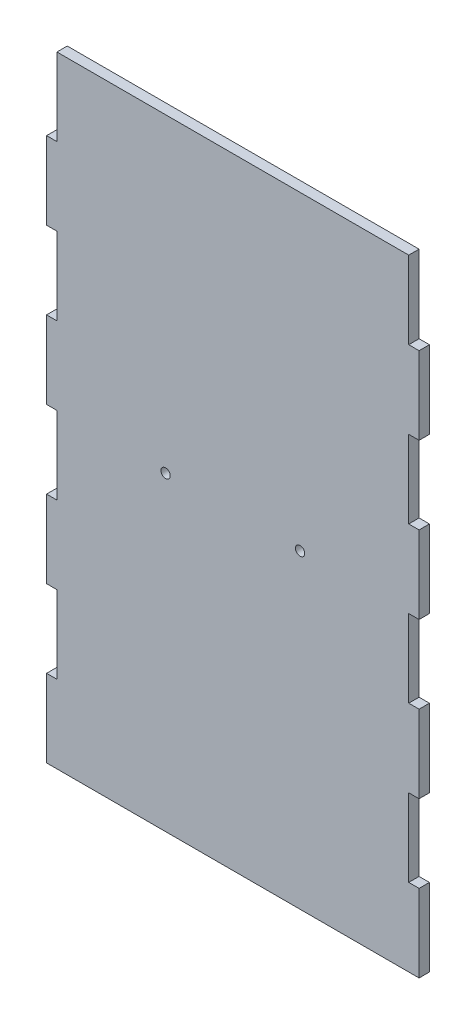
ISO-10303-21;
HEADER;
FILE_DESCRIPTION(('STEP AP214'),'2;1');
FILE_NAME('part.step','',(''),(''),'','','');
FILE_SCHEMA(('AUTOMOTIVE_DESIGN { 1 0 10303 214 1 1 1 1 }'));
ENDSEC;
DATA;
#1=APPLICATION_CONTEXT('core data for automotive mechanical design processes');
#2=APPLICATION_PROTOCOL_DEFINITION('international standard','automotive_design',2000,#1);
#3=PRODUCT_CONTEXT('',#1,'mechanical');
#4=PRODUCT('Part','Part','',(#3));
#5=PRODUCT_RELATED_PRODUCT_CATEGORY('part','',(#4));
#6=PRODUCT_DEFINITION_FORMATION('','',#4);
#7=PRODUCT_DEFINITION_CONTEXT('part definition',#1,'design');
#8=PRODUCT_DEFINITION('design','',#6,#7);
#9=PRODUCT_DEFINITION_SHAPE('','',#8);
#10=(LENGTH_UNIT() NAMED_UNIT(*) SI_UNIT(.MILLI.,.METRE.));
#11=(NAMED_UNIT(*) PLANE_ANGLE_UNIT() SI_UNIT($,.RADIAN.));
#12=(NAMED_UNIT(*) SI_UNIT($,.STERADIAN.) SOLID_ANGLE_UNIT());
#13=UNCERTAINTY_MEASURE_WITH_UNIT(LENGTH_MEASURE(1.E-05),#10,'distance_accuracy_value','');
#14=(GEOMETRIC_REPRESENTATION_CONTEXT(3) GLOBAL_UNCERTAINTY_ASSIGNED_CONTEXT((#13)) GLOBAL_UNIT_ASSIGNED_CONTEXT((#10,
#11,#12)) REPRESENTATION_CONTEXT('',''));
#15=CARTESIAN_POINT('',(0.,0.,0.));
#16=DIRECTION('',(0.,0.,1.));
#17=DIRECTION('',(1.,0.,0.));
#18=AXIS2_PLACEMENT_3D('',#15,#16,#17);
#19=CARTESIAN_POINT('',(90.,0.,5.));
#20=DIRECTION('',(-1.,0.,0.));
#21=DIRECTION('',(0.,0.,1.));
#22=AXIS2_PLACEMENT_3D('',#19,#20,#21);
#23=PLANE('',#22);
#24=DIRECTION('',(0.,1.,0.));
#25=VECTOR('',#24,1.);
#26=CARTESIAN_POINT('',(90.,0.,0.));
#27=LINE('',#26,#25);
#28=CARTESIAN_POINT('',(90.,0.,0.));
#29=VERTEX_POINT('',#28);
#30=CARTESIAN_POINT('',(90.,37.4999999999999,0.));
#31=VERTEX_POINT('',#30);
#32=EDGE_CURVE('E261',#29,#31,#27,.T.);
#33=ORIENTED_EDGE('',*,*,#32,.T.);
#34=DIRECTION('',(0.,0.,1.));
#35=VECTOR('',#34,1.);
#36=CARTESIAN_POINT('',(90.,37.4999999999999,-0.00100000000000013));
#37=LINE('',#36,#35);
#38=CARTESIAN_POINT('',(90.,37.4999999999999,5.));
#39=VERTEX_POINT('',#38);
#40=EDGE_CURVE('E241',#31,#39,#37,.T.);
#41=ORIENTED_EDGE('',*,*,#40,.T.);
#42=DIRECTION('',(0.,1.,0.));
#43=VECTOR('',#42,1.);
#44=CARTESIAN_POINT('',(90.,0.,5.));
#45=LINE('',#44,#43);
#46=CARTESIAN_POINT('',(90.,0.,5.));
#47=VERTEX_POINT('',#46);
#48=EDGE_CURVE('E294',#47,#39,#45,.T.);
#49=ORIENTED_EDGE('',*,*,#48,.F.);
#50=DIRECTION('',(0.,0.,-1.));
#51=VECTOR('',#50,1.);
#52=CARTESIAN_POINT('',(90.,0.,5.));
#53=LINE('',#52,#51);
#54=EDGE_CURVE('E41',#47,#29,#53,.T.);
#55=ORIENTED_EDGE('',*,*,#54,.T.);
#56=EDGE_LOOP('',(#33,#41,#49,#55));
#57=FACE_BOUND('',#56,.T.);
#58=ADVANCED_FACE('F33',(#57),#23,.F.);
#59=CARTESIAN_POINT('',(90.,74.9999999999999,5.));
#60=VERTEX_POINT('',#59);
#61=CARTESIAN_POINT('',(90.,112.5,5.));
#62=VERTEX_POINT('',#61);
#63=EDGE_CURVE('E297',#60,#62,#45,.T.);
#64=ORIENTED_EDGE('',*,*,#63,.F.);
#65=DIRECTION('',(0.,0.,1.));
#66=VECTOR('',#65,1.);
#67=CARTESIAN_POINT('',(90.,74.9999999999999,-0.00100000000000013));
#68=LINE('',#67,#66);
#69=CARTESIAN_POINT('',(90.,74.9999999999999,0.));
#70=VERTEX_POINT('',#69);
#71=EDGE_CURVE('E552',#70,#60,#68,.T.);
#72=ORIENTED_EDGE('',*,*,#71,.F.);
#73=CARTESIAN_POINT('',(90.,112.5,0.));
#74=VERTEX_POINT('',#73);
#75=EDGE_CURVE('E269',#70,#74,#27,.T.);
#76=ORIENTED_EDGE('',*,*,#75,.T.);
#77=DIRECTION('',(0.,0.,1.));
#78=VECTOR('',#77,1.);
#79=CARTESIAN_POINT('',(90.,112.5,-0.00100000000000013));
#80=LINE('',#79,#78);
#81=EDGE_CURVE('E575',#74,#62,#80,.T.);
#82=ORIENTED_EDGE('',*,*,#81,.T.);
#83=EDGE_LOOP('',(#64,#72,#76,#82));
#84=FACE_BOUND('',#83,.T.);
#85=ADVANCED_FACE('F453',(#84),#23,.F.);
#86=CARTESIAN_POINT('',(90.,150.,5.));
#87=VERTEX_POINT('',#86);
#88=CARTESIAN_POINT('',(90.,187.5,5.));
#89=VERTEX_POINT('',#88);
#90=EDGE_CURVE('E480',#87,#89,#45,.T.);
#91=ORIENTED_EDGE('',*,*,#90,.F.);
#92=DIRECTION('',(0.,0.,1.));
#93=VECTOR('',#92,1.);
#94=CARTESIAN_POINT('',(90.,150.,-0.00100000000000013));
#95=LINE('',#94,#93);
#96=CARTESIAN_POINT('',(90.,150.,0.));
#97=VERTEX_POINT('',#96);
#98=EDGE_CURVE('E481',#97,#87,#95,.T.);
#99=ORIENTED_EDGE('',*,*,#98,.F.);
#100=CARTESIAN_POINT('',(90.,187.5,0.));
#101=VERTEX_POINT('',#100);
#102=EDGE_CURVE('E274',#97,#101,#27,.T.);
#103=ORIENTED_EDGE('',*,*,#102,.T.);
#104=DIRECTION('',(0.,0.,1.));
#105=VECTOR('',#104,1.);
#106=CARTESIAN_POINT('',(90.,187.5,-0.00100000000000013));
#107=LINE('',#106,#105);
#108=EDGE_CURVE('E484',#101,#89,#107,.T.);
#109=ORIENTED_EDGE('',*,*,#108,.T.);
#110=EDGE_LOOP('',(#91,#99,#103,#109));
#111=FACE_BOUND('',#110,.T.);
#112=ADVANCED_FACE('F457',(#111),#23,.F.);
#113=CARTESIAN_POINT('',(-90.,0.,5.));
#114=DIRECTION('',(1.,0.,0.));
#115=DIRECTION('',(0.,0.,-1.));
#116=AXIS2_PLACEMENT_3D('',#113,#114,#115);
#117=PLANE('',#116);
#118=DIRECTION('',(0.,-1.,0.));
#119=VECTOR('',#118,1.);
#120=CARTESIAN_POINT('',(-90.,0.,0.));
#121=LINE('',#120,#119);
#122=CARTESIAN_POINT('',(-90.,112.5,0.));
#123=VERTEX_POINT('',#122);
#124=CARTESIAN_POINT('',(-90.,75.,0.));
#125=VERTEX_POINT('',#124);
#126=EDGE_CURVE('E318',#123,#125,#121,.T.);
#127=ORIENTED_EDGE('',*,*,#126,.T.);
#128=DIRECTION('',(0.,0.,1.));
#129=VECTOR('',#128,1.);
#130=CARTESIAN_POINT('',(-90.,75.,-0.00100000000000013));
#131=LINE('',#130,#129);
#132=CARTESIAN_POINT('',(-90.,75.,5.));
#133=VERTEX_POINT('',#132);
#134=EDGE_CURVE('E330',#125,#133,#131,.T.);
#135=ORIENTED_EDGE('',*,*,#134,.T.);
#136=DIRECTION('',(0.,-1.,0.));
#137=VECTOR('',#136,1.);
#138=CARTESIAN_POINT('',(-90.,0.,5.));
#139=LINE('',#138,#137);
#140=CARTESIAN_POINT('',(-90.,112.5,5.));
#141=VERTEX_POINT('',#140);
#142=EDGE_CURVE('E541',#141,#133,#139,.T.);
#143=ORIENTED_EDGE('',*,*,#142,.F.);
#144=DIRECTION('',(0.,0.,1.));
#145=VECTOR('',#144,1.);
#146=CARTESIAN_POINT('',(-90.,112.5,-0.00100000000000013));
#147=LINE('',#146,#145);
#148=EDGE_CURVE('E332',#123,#141,#147,.T.);
#149=ORIENTED_EDGE('',*,*,#148,.F.);
#150=EDGE_LOOP('',(#127,#135,#143,#149));
#151=FACE_BOUND('',#150,.T.);
#152=ADVANCED_FACE('F328',(#151),#117,.F.);
#153=CARTESIAN_POINT('',(-90.,187.5,0.));
#154=VERTEX_POINT('',#153);
#155=CARTESIAN_POINT('',(-90.,150.,0.));
#156=VERTEX_POINT('',#155);
#157=EDGE_CURVE('E312',#154,#156,#121,.T.);
#158=ORIENTED_EDGE('',*,*,#157,.T.);
#159=DIRECTION('',(0.,0.,1.));
#160=VECTOR('',#159,1.);
#161=CARTESIAN_POINT('',(-90.,150.,-0.00100000000000013));
#162=LINE('',#161,#160);
#163=CARTESIAN_POINT('',(-90.,150.,5.));
#164=VERTEX_POINT('',#163);
#165=EDGE_CURVE('E378',#156,#164,#162,.T.);
#166=ORIENTED_EDGE('',*,*,#165,.T.);
#167=CARTESIAN_POINT('',(-90.,187.5,5.));
#168=VERTEX_POINT('',#167);
#169=EDGE_CURVE('E304',#168,#164,#139,.T.);
#170=ORIENTED_EDGE('',*,*,#169,.F.);
#171=DIRECTION('',(0.,0.,1.));
#172=VECTOR('',#171,1.);
#173=CARTESIAN_POINT('',(-90.,187.5,-0.00100000000000013));
#174=LINE('',#173,#172);
#175=EDGE_CURVE('E401',#154,#168,#174,.T.);
#176=ORIENTED_EDGE('',*,*,#175,.F.);
#177=EDGE_LOOP('',(#158,#166,#170,#176));
#178=FACE_BOUND('',#177,.T.);
#179=ADVANCED_FACE('F475',(#178),#117,.F.);
#180=CARTESIAN_POINT('',(-90.,262.5,0.));
#181=VERTEX_POINT('',#180);
#182=CARTESIAN_POINT('',(-90.,225.,0.));
#183=VERTEX_POINT('',#182);
#184=EDGE_CURVE('E310',#181,#183,#121,.T.);
#185=ORIENTED_EDGE('',*,*,#184,.T.);
#186=DIRECTION('',(0.,0.,1.));
#187=VECTOR('',#186,1.);
#188=CARTESIAN_POINT('',(-90.,225.,-0.00100000000000013));
#189=LINE('',#188,#187);
#190=CARTESIAN_POINT('',(-90.,225.,5.));
#191=VERTEX_POINT('',#190);
#192=EDGE_CURVE('E402',#183,#191,#189,.T.);
#193=ORIENTED_EDGE('',*,*,#192,.T.);
#194=CARTESIAN_POINT('',(-90.,262.5,5.));
#195=VERTEX_POINT('',#194);
#196=EDGE_CURVE('E301',#195,#191,#139,.T.);
#197=ORIENTED_EDGE('',*,*,#196,.F.);
#198=DIRECTION('',(0.,0.,1.));
#199=VECTOR('',#198,1.);
#200=CARTESIAN_POINT('',(-90.,262.5,-0.00100000000000013));
#201=LINE('',#200,#199);
#202=EDGE_CURVE('E421',#181,#195,#201,.T.);
#203=ORIENTED_EDGE('',*,*,#202,.F.);
#204=EDGE_LOOP('',(#185,#193,#197,#203));
#205=FACE_BOUND('',#204,.T.);
#206=ADVANCED_FACE('F523',(#205),#117,.F.);
#207=CARTESIAN_POINT('',(0.,0.,5.));
#208=DIRECTION('',(0.,0.,-1.));
#209=DIRECTION('',(-1.,0.,0.));
#210=AXIS2_PLACEMENT_3D('',#207,#208,#209);
#211=PLANE('',#210);
#212=CARTESIAN_POINT('',(-32.5,150.,5.));
#213=DIRECTION('',(0.,0.,1.));
#214=DIRECTION('',(1.,0.,0.));
#215=AXIS2_PLACEMENT_3D('',#212,#213,#214);
#216=CIRCLE('',#215,2.25);
#217=CARTESIAN_POINT('',(-30.25,150.,5.));
#218=VERTEX_POINT('',#217);
#219=EDGE_CURVE('E276',#218,#218,#216,.T.);
#220=ORIENTED_EDGE('',*,*,#219,.F.);
#221=EDGE_LOOP('',(#220));
#222=FACE_BOUND('',#221,.T.);
#223=ORIENTED_EDGE('',*,*,#48,.T.);
#224=DIRECTION('',(1.,0.,0.));
#225=VECTOR('',#224,1.);
#226=CARTESIAN_POINT('',(90.,37.4999999999999,5.));
#227=LINE('',#226,#225);
#228=CARTESIAN_POINT('',(85.,37.4999999999999,5.));
#229=VERTEX_POINT('',#228);
#230=EDGE_CURVE('E247',#229,#39,#227,.T.);
#231=ORIENTED_EDGE('',*,*,#230,.F.);
#232=DIRECTION('',(0.,-1.,0.));
#233=VECTOR('',#232,1.);
#234=CARTESIAN_POINT('',(84.9999999999999,74.9999999999999,5.));
#235=LINE('',#234,#233);
#236=CARTESIAN_POINT('',(84.9999999999999,74.9999999999999,5.));
#237=VERTEX_POINT('',#236);
#238=EDGE_CURVE('E551',#237,#229,#235,.T.);
#239=ORIENTED_EDGE('',*,*,#238,.F.);
#240=DIRECTION('',(-1.,0.,0.));
#241=VECTOR('',#240,1.);
#242=CARTESIAN_POINT('',(90.,74.9999999999999,5.));
#243=LINE('',#242,#241);
#244=EDGE_CURVE('E264',#60,#237,#243,.T.);
#245=ORIENTED_EDGE('',*,*,#244,.F.);
#246=ORIENTED_EDGE('',*,*,#63,.T.);
#247=DIRECTION('',(1.,0.,0.));
#248=VECTOR('',#247,1.);
#249=CARTESIAN_POINT('',(90.,112.5,5.));
#250=LINE('',#249,#248);
#251=CARTESIAN_POINT('',(84.9999999999999,112.5,5.));
#252=VERTEX_POINT('',#251);
#253=EDGE_CURVE('E572',#252,#62,#250,.T.);
#254=ORIENTED_EDGE('',*,*,#253,.F.);
#255=DIRECTION('',(0.,-1.,0.));
#256=VECTOR('',#255,1.);
#257=CARTESIAN_POINT('',(85.,150.,5.));
#258=LINE('',#257,#256);
#259=CARTESIAN_POINT('',(85.,150.,5.));
#260=VERTEX_POINT('',#259);
#261=EDGE_CURVE('E569',#260,#252,#258,.T.);
#262=ORIENTED_EDGE('',*,*,#261,.F.);
#263=DIRECTION('',(-1.,0.,0.));
#264=VECTOR('',#263,1.);
#265=CARTESIAN_POINT('',(90.,150.,5.));
#266=LINE('',#265,#264);
#267=EDGE_CURVE('E567',#87,#260,#266,.T.);
#268=ORIENTED_EDGE('',*,*,#267,.F.);
#269=ORIENTED_EDGE('',*,*,#90,.T.);
#270=DIRECTION('',(1.,0.,0.));
#271=VECTOR('',#270,1.);
#272=CARTESIAN_POINT('',(90.,187.5,5.));
#273=LINE('',#272,#271);
#274=CARTESIAN_POINT('',(84.9999999999999,187.5,5.));
#275=VERTEX_POINT('',#274);
#276=EDGE_CURVE('E595',#275,#89,#273,.T.);
#277=ORIENTED_EDGE('',*,*,#276,.F.);
#278=DIRECTION('',(0.,-1.,0.));
#279=VECTOR('',#278,1.);
#280=CARTESIAN_POINT('',(84.9999999999999,225.,5.));
#281=LINE('',#280,#279);
#282=CARTESIAN_POINT('',(84.9999999999999,225.,5.));
#283=VERTEX_POINT('',#282);
#284=EDGE_CURVE('E592',#283,#275,#281,.T.);
#285=ORIENTED_EDGE('',*,*,#284,.F.);
#286=DIRECTION('',(-1.,0.,0.));
#287=VECTOR('',#286,1.);
#288=CARTESIAN_POINT('',(90.,225.,5.));
#289=LINE('',#288,#287);
#290=CARTESIAN_POINT('',(90.,225.,5.));
#291=VERTEX_POINT('',#290);
#292=EDGE_CURVE('E496',#291,#283,#289,.T.);
#293=ORIENTED_EDGE('',*,*,#292,.F.);
#294=CARTESIAN_POINT('',(90.,262.5,5.));
#295=VERTEX_POINT('',#294);
#296=EDGE_CURVE('E298',#291,#295,#45,.T.);
#297=ORIENTED_EDGE('',*,*,#296,.T.);
#298=DIRECTION('',(1.,0.,0.));
#299=VECTOR('',#298,1.);
#300=CARTESIAN_POINT('',(90.,262.5,5.));
#301=LINE('',#300,#299);
#302=CARTESIAN_POINT('',(84.9999999999999,262.5,5.));
#303=VERTEX_POINT('',#302);
#304=EDGE_CURVE('E493',#303,#295,#301,.T.);
#305=ORIENTED_EDGE('',*,*,#304,.F.);
#306=DIRECTION('',(0.,-1.,0.));
#307=VECTOR('',#306,1.);
#308=CARTESIAN_POINT('',(85.,300.,5.));
#309=LINE('',#308,#307);
#310=CARTESIAN_POINT('',(85.,300.,5.));
#311=VERTEX_POINT('',#310);
#312=EDGE_CURVE('E504',#311,#303,#309,.T.);
#313=ORIENTED_EDGE('',*,*,#312,.F.);
#314=DIRECTION('',(-1.,0.,0.));
#315=VECTOR('',#314,1.);
#316=CARTESIAN_POINT('',(-90.,300.,5.));
#317=LINE('',#316,#315);
#318=CARTESIAN_POINT('',(-85.,300.,5.));
#319=VERTEX_POINT('',#318);
#320=EDGE_CURVE('E296',#311,#319,#317,.T.);
#321=ORIENTED_EDGE('',*,*,#320,.T.);
#322=DIRECTION('',(0.,1.,0.));
#323=VECTOR('',#322,1.);
#324=CARTESIAN_POINT('',(-85.,300.,5.));
#325=LINE('',#324,#323);
#326=CARTESIAN_POINT('',(-85.,262.5,5.));
#327=VERTEX_POINT('',#326);
#328=EDGE_CURVE('E418',#327,#319,#325,.T.);
#329=ORIENTED_EDGE('',*,*,#328,.F.);
#330=DIRECTION('',(1.,0.,0.));
#331=VECTOR('',#330,1.);
#332=CARTESIAN_POINT('',(-90.,262.5,5.));
#333=LINE('',#332,#331);
#334=EDGE_CURVE('E415',#195,#327,#333,.T.);
#335=ORIENTED_EDGE('',*,*,#334,.F.);
#336=ORIENTED_EDGE('',*,*,#196,.T.);
#337=DIRECTION('',(-1.,0.,0.));
#338=VECTOR('',#337,1.);
#339=CARTESIAN_POINT('',(-90.,225.,5.));
#340=LINE('',#339,#338);
#341=CARTESIAN_POINT('',(-85.,225.,5.));
#342=VERTEX_POINT('',#341);
#343=EDGE_CURVE('E399',#342,#191,#340,.T.);
#344=ORIENTED_EDGE('',*,*,#343,.F.);
#345=DIRECTION('',(0.,1.,0.));
#346=VECTOR('',#345,1.);
#347=CARTESIAN_POINT('',(-85.,225.,5.));
#348=LINE('',#347,#346);
#349=CARTESIAN_POINT('',(-85.,187.5,5.));
#350=VERTEX_POINT('',#349);
#351=EDGE_CURVE('E396',#350,#342,#348,.T.);
#352=ORIENTED_EDGE('',*,*,#351,.F.);
#353=DIRECTION('',(1.,0.,0.));
#354=VECTOR('',#353,1.);
#355=CARTESIAN_POINT('',(-90.,187.5,5.));
#356=LINE('',#355,#354);
#357=EDGE_CURVE('E393',#168,#350,#356,.T.);
#358=ORIENTED_EDGE('',*,*,#357,.F.);
#359=ORIENTED_EDGE('',*,*,#169,.T.);
#360=DIRECTION('',(-1.,0.,0.));
#361=VECTOR('',#360,1.);
#362=CARTESIAN_POINT('',(-90.,150.,5.));
#363=LINE('',#362,#361);
#364=CARTESIAN_POINT('',(-85.,150.,5.));
#365=VERTEX_POINT('',#364);
#366=EDGE_CURVE('E376',#365,#164,#363,.T.);
#367=ORIENTED_EDGE('',*,*,#366,.F.);
#368=DIRECTION('',(0.,1.,0.));
#369=VECTOR('',#368,1.);
#370=CARTESIAN_POINT('',(-85.,150.,5.));
#371=LINE('',#370,#369);
#372=CARTESIAN_POINT('',(-85.,112.5,5.));
#373=VERTEX_POINT('',#372);
#374=EDGE_CURVE('E373',#373,#365,#371,.T.);
#375=ORIENTED_EDGE('',*,*,#374,.F.);
#376=DIRECTION('',(1.,0.,0.));
#377=VECTOR('',#376,1.);
#378=CARTESIAN_POINT('',(-90.,112.5,5.));
#379=LINE('',#378,#377);
#380=EDGE_CURVE('E370',#141,#373,#379,.T.);
#381=ORIENTED_EDGE('',*,*,#380,.F.);
#382=ORIENTED_EDGE('',*,*,#142,.T.);
#383=DIRECTION('',(-1.,0.,0.));
#384=VECTOR('',#383,1.);
#385=CARTESIAN_POINT('',(-90.,75.,5.));
#386=LINE('',#385,#384);
#387=CARTESIAN_POINT('',(-85.,75.,5.));
#388=VERTEX_POINT('',#387);
#389=EDGE_CURVE('E354',#388,#133,#386,.T.);
#390=ORIENTED_EDGE('',*,*,#389,.F.);
#391=DIRECTION('',(0.,1.,0.));
#392=VECTOR('',#391,1.);
#393=CARTESIAN_POINT('',(-85.,75.,5.));
#394=LINE('',#393,#392);
#395=CARTESIAN_POINT('',(-85.,37.5,5.));
#396=VERTEX_POINT('',#395);
#397=EDGE_CURVE('E346',#396,#388,#394,.T.);
#398=ORIENTED_EDGE('',*,*,#397,.F.);
#399=DIRECTION('',(1.,0.,0.));
#400=VECTOR('',#399,1.);
#401=CARTESIAN_POINT('',(-90.,37.5,5.));
#402=LINE('',#401,#400);
#403=CARTESIAN_POINT('',(-90.,37.5,5.));
#404=VERTEX_POINT('',#403);
#405=EDGE_CURVE('E343',#404,#396,#402,.T.);
#406=ORIENTED_EDGE('',*,*,#405,.F.);
#407=CARTESIAN_POINT('',(-90.,0.,5.));
#408=VERTEX_POINT('',#407);
#409=EDGE_CURVE('E300',#404,#408,#139,.T.);
#410=ORIENTED_EDGE('',*,*,#409,.T.);
#411=DIRECTION('',(1.,0.,0.));
#412=VECTOR('',#411,1.);
#413=CARTESIAN_POINT('',(-90.,0.,5.));
#414=LINE('',#413,#412);
#415=EDGE_CURVE('E303',#408,#47,#414,.T.);
#416=ORIENTED_EDGE('',*,*,#415,.T.);
#417=EDGE_LOOP('',(#223,#231,#239,#245,#246,#254,#262,#268,#269,#277,#285,#293,#297,#305,#313,
#321,#329,#335,#336,#344,#352,#358,#359,#367,#375,#381,#382,#390,#398,#406,#410,#416));
#418=FACE_BOUND('',#417,.T.);
#419=CARTESIAN_POINT('',(32.5,150.,5.));
#420=DIRECTION('',(0.,0.,1.));
#421=DIRECTION('',(1.,0.,0.));
#422=AXIS2_PLACEMENT_3D('',#419,#420,#421);
#423=CIRCLE('',#422,2.25);
#424=CARTESIAN_POINT('',(34.75,150.,5.));
#425=VERTEX_POINT('',#424);
#426=EDGE_CURVE('E288',#425,#425,#423,.T.);
#427=ORIENTED_EDGE('',*,*,#426,.F.);
#428=EDGE_LOOP('',(#427));
#429=FACE_BOUND('',#428,.T.);
#430=ADVANCED_FACE('F467',(#222,#418,#429),#211,.F.);
#431=CARTESIAN_POINT('',(0.,0.,0.));
#432=DIRECTION('',(0.,0.,-1.));
#433=DIRECTION('',(-1.,0.,0.));
#434=AXIS2_PLACEMENT_3D('',#431,#432,#433);
#435=PLANE('',#434);
#436=DIRECTION('',(1.,0.,0.));
#437=VECTOR('',#436,1.);
#438=CARTESIAN_POINT('',(90.,37.4999999999999,0.));
#439=LINE('',#438,#437);
#440=CARTESIAN_POINT('',(85.,37.4999999999999,0.));
#441=VERTEX_POINT('',#440);
#442=EDGE_CURVE('E244',#441,#31,#439,.T.);
#443=ORIENTED_EDGE('',*,*,#442,.T.);
#444=ORIENTED_EDGE('',*,*,#32,.F.);
#445=DIRECTION('',(1.,0.,0.));
#446=VECTOR('',#445,1.);
#447=CARTESIAN_POINT('',(-90.,0.,0.));
#448=LINE('',#447,#446);
#449=CARTESIAN_POINT('',(-90.,0.,0.));
#450=VERTEX_POINT('',#449);
#451=EDGE_CURVE('E308',#450,#29,#448,.T.);
#452=ORIENTED_EDGE('',*,*,#451,.F.);
#453=CARTESIAN_POINT('',(-90.,37.5,0.));
#454=VERTEX_POINT('',#453);
#455=EDGE_CURVE('E272',#454,#450,#121,.T.);
#456=ORIENTED_EDGE('',*,*,#455,.F.);
#457=DIRECTION('',(1.,0.,0.));
#458=VECTOR('',#457,1.);
#459=CARTESIAN_POINT('',(-90.,37.5,0.));
#460=LINE('',#459,#458);
#461=CARTESIAN_POINT('',(-85.,37.5,0.));
#462=VERTEX_POINT('',#461);
#463=EDGE_CURVE('E358',#454,#462,#460,.T.);
#464=ORIENTED_EDGE('',*,*,#463,.T.);
#465=DIRECTION('',(0.,1.,0.));
#466=VECTOR('',#465,1.);
#467=CARTESIAN_POINT('',(-85.,75.,0.));
#468=LINE('',#467,#466);
#469=CARTESIAN_POINT('',(-85.,75.,0.));
#470=VERTEX_POINT('',#469);
#471=EDGE_CURVE('E340',#462,#470,#468,.T.);
#472=ORIENTED_EDGE('',*,*,#471,.T.);
#473=DIRECTION('',(-1.,0.,0.));
#474=VECTOR('',#473,1.);
#475=CARTESIAN_POINT('',(-90.,75.,0.));
#476=LINE('',#475,#474);
#477=EDGE_CURVE('E338',#470,#125,#476,.T.);
#478=ORIENTED_EDGE('',*,*,#477,.T.);
#479=ORIENTED_EDGE('',*,*,#126,.F.);
#480=DIRECTION('',(1.,0.,0.));
#481=VECTOR('',#480,1.);
#482=CARTESIAN_POINT('',(-90.,112.5,0.));
#483=LINE('',#482,#481);
#484=CARTESIAN_POINT('',(-85.,112.5,0.));
#485=VERTEX_POINT('',#484);
#486=EDGE_CURVE('E336',#123,#485,#483,.T.);
#487=ORIENTED_EDGE('',*,*,#486,.T.);
#488=DIRECTION('',(0.,1.,0.));
#489=VECTOR('',#488,1.);
#490=CARTESIAN_POINT('',(-85.,150.,0.));
#491=LINE('',#490,#489);
#492=CARTESIAN_POINT('',(-85.,150.,0.));
#493=VERTEX_POINT('',#492);
#494=EDGE_CURVE('E365',#485,#493,#491,.T.);
#495=ORIENTED_EDGE('',*,*,#494,.T.);
#496=DIRECTION('',(-1.,0.,0.));
#497=VECTOR('',#496,1.);
#498=CARTESIAN_POINT('',(-90.,150.,0.));
#499=LINE('',#498,#497);
#500=EDGE_CURVE('E367',#493,#156,#499,.T.);
#501=ORIENTED_EDGE('',*,*,#500,.T.);
#502=ORIENTED_EDGE('',*,*,#157,.F.);
#503=DIRECTION('',(1.,0.,0.));
#504=VECTOR('',#503,1.);
#505=CARTESIAN_POINT('',(-90.,187.5,0.));
#506=LINE('',#505,#504);
#507=CARTESIAN_POINT('',(-85.,187.5,0.));
#508=VERTEX_POINT('',#507);
#509=EDGE_CURVE('E404',#154,#508,#506,.T.);
#510=ORIENTED_EDGE('',*,*,#509,.T.);
#511=DIRECTION('',(0.,1.,0.));
#512=VECTOR('',#511,1.);
#513=CARTESIAN_POINT('',(-85.,225.,0.));
#514=LINE('',#513,#512);
#515=CARTESIAN_POINT('',(-85.,225.,0.));
#516=VERTEX_POINT('',#515);
#517=EDGE_CURVE('E387',#508,#516,#514,.T.);
#518=ORIENTED_EDGE('',*,*,#517,.T.);
#519=DIRECTION('',(-1.,0.,0.));
#520=VECTOR('',#519,1.);
#521=CARTESIAN_POINT('',(-90.,225.,0.));
#522=LINE('',#521,#520);
#523=EDGE_CURVE('E390',#516,#183,#522,.T.);
#524=ORIENTED_EDGE('',*,*,#523,.T.);
#525=ORIENTED_EDGE('',*,*,#184,.F.);
#526=DIRECTION('',(1.,0.,0.));
#527=VECTOR('',#526,1.);
#528=CARTESIAN_POINT('',(-90.,262.5,0.));
#529=LINE('',#528,#527);
#530=CARTESIAN_POINT('',(-85.,262.5,0.));
#531=VERTEX_POINT('',#530);
#532=EDGE_CURVE('E425',#181,#531,#529,.T.);
#533=ORIENTED_EDGE('',*,*,#532,.T.);
#534=DIRECTION('',(0.,1.,0.));
#535=VECTOR('',#534,1.);
#536=CARTESIAN_POINT('',(-85.,300.,0.));
#537=LINE('',#536,#535);
#538=CARTESIAN_POINT('',(-85.,300.,0.));
#539=VERTEX_POINT('',#538);
#540=EDGE_CURVE('E412',#531,#539,#537,.T.);
#541=ORIENTED_EDGE('',*,*,#540,.T.);
#542=DIRECTION('',(-1.,0.,0.));
#543=VECTOR('',#542,1.);
#544=CARTESIAN_POINT('',(-90.,300.,0.));
#545=LINE('',#544,#543);
#546=CARTESIAN_POINT('',(84.9999999999999,300.,0.));
#547=VERTEX_POINT('',#546);
#548=EDGE_CURVE('E268',#547,#539,#545,.T.);
#549=ORIENTED_EDGE('',*,*,#548,.F.);
#550=DIRECTION('',(0.,-1.,0.));
#551=VECTOR('',#550,1.);
#552=CARTESIAN_POINT('',(85.,300.,0.));
#553=LINE('',#552,#551);
#554=CARTESIAN_POINT('',(84.9999999999999,262.5,0.));
#555=VERTEX_POINT('',#554);
#556=EDGE_CURVE('E513',#547,#555,#553,.T.);
#557=ORIENTED_EDGE('',*,*,#556,.T.);
#558=DIRECTION('',(1.,0.,0.));
#559=VECTOR('',#558,1.);
#560=CARTESIAN_POINT('',(90.,262.5,0.));
#561=LINE('',#560,#559);
#562=CARTESIAN_POINT('',(90.,262.5,0.));
#563=VERTEX_POINT('',#562);
#564=EDGE_CURVE('E517',#555,#563,#561,.T.);
#565=ORIENTED_EDGE('',*,*,#564,.T.);
#566=CARTESIAN_POINT('',(90.,225.,0.));
#567=VERTEX_POINT('',#566);
#568=EDGE_CURVE('E271',#567,#563,#27,.T.);
#569=ORIENTED_EDGE('',*,*,#568,.F.);
#570=DIRECTION('',(-1.,0.,0.));
#571=VECTOR('',#570,1.);
#572=CARTESIAN_POINT('',(90.,225.,0.));
#573=LINE('',#572,#571);
#574=CARTESIAN_POINT('',(84.9999999999999,225.,0.));
#575=VERTEX_POINT('',#574);
#576=EDGE_CURVE('E599',#567,#575,#573,.T.);
#577=ORIENTED_EDGE('',*,*,#576,.T.);
#578=DIRECTION('',(0.,-1.,0.));
#579=VECTOR('',#578,1.);
#580=CARTESIAN_POINT('',(84.9999999999999,225.,0.));
#581=LINE('',#580,#579);
#582=CARTESIAN_POINT('',(84.9999999999999,187.5,0.));
#583=VERTEX_POINT('',#582);
#584=EDGE_CURVE('E585',#575,#583,#581,.T.);
#585=ORIENTED_EDGE('',*,*,#584,.T.);
#586=DIRECTION('',(1.,0.,0.));
#587=VECTOR('',#586,1.);
#588=CARTESIAN_POINT('',(90.,187.5,0.));
#589=LINE('',#588,#587);
#590=EDGE_CURVE('E588',#583,#101,#589,.T.);
#591=ORIENTED_EDGE('',*,*,#590,.T.);
#592=ORIENTED_EDGE('',*,*,#102,.F.);
#593=DIRECTION('',(-1.,0.,0.));
#594=VECTOR('',#593,1.);
#595=CARTESIAN_POINT('',(90.,150.,0.));
#596=LINE('',#595,#594);
#597=CARTESIAN_POINT('',(85.,150.,0.));
#598=VERTEX_POINT('',#597);
#599=EDGE_CURVE('E578',#97,#598,#596,.T.);
#600=ORIENTED_EDGE('',*,*,#599,.T.);
#601=DIRECTION('',(0.,-1.,0.));
#602=VECTOR('',#601,1.);
#603=CARTESIAN_POINT('',(85.,150.,0.));
#604=LINE('',#603,#602);
#605=CARTESIAN_POINT('',(84.9999999999999,112.5,0.));
#606=VERTEX_POINT('',#605);
#607=EDGE_CURVE('E561',#598,#606,#604,.T.);
#608=ORIENTED_EDGE('',*,*,#607,.T.);
#609=DIRECTION('',(1.,0.,0.));
#610=VECTOR('',#609,1.);
#611=CARTESIAN_POINT('',(90.,112.5,0.));
#612=LINE('',#611,#610);
#613=EDGE_CURVE('E564',#606,#74,#612,.T.);
#614=ORIENTED_EDGE('',*,*,#613,.T.);
#615=ORIENTED_EDGE('',*,*,#75,.F.);
#616=DIRECTION('',(-1.,0.,0.));
#617=VECTOR('',#616,1.);
#618=CARTESIAN_POINT('',(90.,74.9999999999999,0.));
#619=LINE('',#618,#617);
#620=CARTESIAN_POINT('',(84.9999999999999,74.9999999999999,0.));
#621=VERTEX_POINT('',#620);
#622=EDGE_CURVE('E252',#70,#621,#619,.T.);
#623=ORIENTED_EDGE('',*,*,#622,.T.);
#624=DIRECTION('',(0.,-1.,0.));
#625=VECTOR('',#624,1.);
#626=CARTESIAN_POINT('',(84.9999999999999,74.9999999999999,0.));
#627=LINE('',#626,#625);
#628=EDGE_CURVE('E263',#621,#441,#627,.T.);
#629=ORIENTED_EDGE('',*,*,#628,.T.);
#630=EDGE_LOOP('',(#443,#444,#452,#456,#464,#472,#478,#479,#487,#495,#501,#502,#510,#518,#524,
#525,#533,#541,#549,#557,#565,#569,#577,#585,#591,#592,#600,#608,#614,#615,#623,#629));
#631=FACE_BOUND('',#630,.T.);
#632=CARTESIAN_POINT('',(-32.5,150.,0.));
#633=DIRECTION('',(0.,0.,1.));
#634=DIRECTION('',(1.,0.,0.));
#635=AXIS2_PLACEMENT_3D('',#632,#633,#634);
#636=CIRCLE('',#635,2.25);
#637=CARTESIAN_POINT('',(-30.25,150.,0.));
#638=VERTEX_POINT('',#637);
#639=EDGE_CURVE('E283',#638,#638,#636,.T.);
#640=ORIENTED_EDGE('',*,*,#639,.T.);
#641=EDGE_LOOP('',(#640));
#642=FACE_BOUND('',#641,.T.);
#643=CARTESIAN_POINT('',(32.5,150.,0.));
#644=DIRECTION('',(0.,0.,1.));
#645=DIRECTION('',(1.,0.,0.));
#646=AXIS2_PLACEMENT_3D('',#643,#644,#645);
#647=CIRCLE('',#646,2.25);
#648=CARTESIAN_POINT('',(34.75,150.,0.));
#649=VERTEX_POINT('',#648);
#650=EDGE_CURVE('E291',#649,#649,#647,.T.);
#651=ORIENTED_EDGE('',*,*,#650,.T.);
#652=EDGE_LOOP('',(#651));
#653=FACE_BOUND('',#652,.T.);
#654=ADVANCED_FACE('F258',(#631,#642,#653),#435,.T.);
#655=ORIENTED_EDGE('',*,*,#296,.F.);
#656=DIRECTION('',(0.,0.,1.));
#657=VECTOR('',#656,1.);
#658=CARTESIAN_POINT('',(90.,225.,-0.00100000000000013));
#659=LINE('',#658,#657);
#660=EDGE_CURVE('E597',#567,#291,#659,.T.);
#661=ORIENTED_EDGE('',*,*,#660,.F.);
#662=ORIENTED_EDGE('',*,*,#568,.T.);
#663=DIRECTION('',(0.,0.,1.));
#664=VECTOR('',#663,1.);
#665=CARTESIAN_POINT('',(90.,262.5,-0.00100000000000013));
#666=LINE('',#665,#664);
#667=EDGE_CURVE('E348',#563,#295,#666,.T.);
#668=ORIENTED_EDGE('',*,*,#667,.T.);
#669=EDGE_LOOP('',(#655,#661,#662,#668));
#670=FACE_BOUND('',#669,.T.);
#671=ADVANCED_FACE('F35',(#670),#23,.F.);
#672=CARTESIAN_POINT('',(-90.,300.,5.));
#673=DIRECTION('',(0.,-1.,0.));
#674=DIRECTION('',(0.,0.,-1.));
#675=AXIS2_PLACEMENT_3D('',#672,#673,#674);
#676=PLANE('',#675);
#677=ORIENTED_EDGE('',*,*,#320,.F.);
#678=DIRECTION('',(0.,0.,1.));
#679=VECTOR('',#678,1.);
#680=CARTESIAN_POINT('',(85.,300.,-0.00100000000000013));
#681=LINE('',#680,#679);
#682=EDGE_CURVE('E503',#547,#311,#681,.T.);
#683=ORIENTED_EDGE('',*,*,#682,.F.);
#684=ORIENTED_EDGE('',*,*,#548,.T.);
#685=DIRECTION('',(0.,0.,1.));
#686=VECTOR('',#685,1.);
#687=CARTESIAN_POINT('',(-85.,300.,-0.00100000000000013));
#688=LINE('',#687,#686);
#689=EDGE_CURVE('E422',#539,#319,#688,.T.);
#690=ORIENTED_EDGE('',*,*,#689,.T.);
#691=EDGE_LOOP('',(#677,#683,#684,#690));
#692=FACE_BOUND('',#691,.T.);
#693=ADVANCED_FACE('F460',(#692),#676,.F.);
#694=ORIENTED_EDGE('',*,*,#409,.F.);
#695=DIRECTION('',(0.,0.,1.));
#696=VECTOR('',#695,1.);
#697=CARTESIAN_POINT('',(-90.,37.5,-0.00100000000000013));
#698=LINE('',#697,#696);
#699=EDGE_CURVE('E356',#454,#404,#698,.T.);
#700=ORIENTED_EDGE('',*,*,#699,.F.);
#701=ORIENTED_EDGE('',*,*,#455,.T.);
#702=DIRECTION('',(0.,0.,-1.));
#703=VECTOR('',#702,1.);
#704=CARTESIAN_POINT('',(-90.,0.,5.));
#705=LINE('',#704,#703);
#706=EDGE_CURVE('E11',#408,#450,#705,.T.);
#707=ORIENTED_EDGE('',*,*,#706,.F.);
#708=EDGE_LOOP('',(#694,#700,#701,#707));
#709=FACE_BOUND('',#708,.T.);
#710=ADVANCED_FACE('F465',(#709),#117,.F.);
#711=CARTESIAN_POINT('',(-90.,0.,5.));
#712=DIRECTION('',(0.,1.,0.));
#713=DIRECTION('',(0.,0.,1.));
#714=AXIS2_PLACEMENT_3D('',#711,#712,#713);
#715=PLANE('',#714);
#716=ORIENTED_EDGE('',*,*,#451,.T.);
#717=ORIENTED_EDGE('',*,*,#54,.F.);
#718=ORIENTED_EDGE('',*,*,#415,.F.);
#719=ORIENTED_EDGE('',*,*,#706,.T.);
#720=EDGE_LOOP('',(#716,#717,#718,#719));
#721=FACE_BOUND('',#720,.T.);
#722=ADVANCED_FACE('F449',(#721),#715,.F.);
#723=CARTESIAN_POINT('',(-32.5,150.,5.));
#724=DIRECTION('',(0.,0.,-1.));
#725=DIRECTION('',(-1.,0.,0.));
#726=AXIS2_PLACEMENT_3D('',#723,#724,#725);
#727=CYLINDRICAL_SURFACE('',#726,2.25);
#728=ORIENTED_EDGE('',*,*,#219,.T.);
#729=EDGE_LOOP('',(#728));
#730=FACE_BOUND('',#729,.T.);
#731=ORIENTED_EDGE('',*,*,#639,.F.);
#732=EDGE_LOOP('',(#731));
#733=FACE_BOUND('',#732,.T.);
#734=ADVANCED_FACE('F440',(#730,#733),#727,.F.);
#735=CARTESIAN_POINT('',(32.5,150.,5.));
#736=DIRECTION('',(0.,0.,-1.));
#737=DIRECTION('',(-1.,0.,0.));
#738=AXIS2_PLACEMENT_3D('',#735,#736,#737);
#739=CYLINDRICAL_SURFACE('',#738,2.25);
#740=ORIENTED_EDGE('',*,*,#426,.T.);
#741=EDGE_LOOP('',(#740));
#742=FACE_BOUND('',#741,.T.);
#743=ORIENTED_EDGE('',*,*,#650,.F.);
#744=EDGE_LOOP('',(#743));
#745=FACE_BOUND('',#744,.T.);
#746=ADVANCED_FACE('F437',(#742,#745),#739,.F.);
#747=CARTESIAN_POINT('',(-85.,300.,-0.00100000000000013));
#748=DIRECTION('',(1.,0.,0.));
#749=DIRECTION('',(0.,0.,-1.));
#750=AXIS2_PLACEMENT_3D('',#747,#748,#749);
#751=PLANE('',#750);
#752=DIRECTION('',(0.,0.,1.));
#753=VECTOR('',#752,1.);
#754=CARTESIAN_POINT('',(-85.,262.5,-0.00100000000000013));
#755=LINE('',#754,#753);
#756=EDGE_CURVE('E426',#531,#327,#755,.T.);
#757=ORIENTED_EDGE('',*,*,#756,.T.);
#758=ORIENTED_EDGE('',*,*,#328,.T.);
#759=ORIENTED_EDGE('',*,*,#689,.F.);
#760=ORIENTED_EDGE('',*,*,#540,.F.);
#761=EDGE_LOOP('',(#757,#758,#759,#760));
#762=FACE_BOUND('',#761,.T.);
#763=ADVANCED_FACE('F439',(#762),#751,.F.);
#764=CARTESIAN_POINT('',(-90.,262.5,-0.00100000000000013));
#765=DIRECTION('',(0.,-1.,0.));
#766=DIRECTION('',(1.,0.,0.));
#767=AXIS2_PLACEMENT_3D('',#764,#765,#766);
#768=PLANE('',#767);
#769=ORIENTED_EDGE('',*,*,#202,.T.);
#770=ORIENTED_EDGE('',*,*,#334,.T.);
#771=ORIENTED_EDGE('',*,*,#756,.F.);
#772=ORIENTED_EDGE('',*,*,#532,.F.);
#773=EDGE_LOOP('',(#769,#770,#771,#772));
#774=FACE_BOUND('',#773,.T.);
#775=ADVANCED_FACE('F446',(#774),#768,.F.);
#776=CARTESIAN_POINT('',(-90.,225.,-0.00100000000000013));
#777=DIRECTION('',(0.,1.,0.));
#778=DIRECTION('',(-1.,0.,0.));
#779=AXIS2_PLACEMENT_3D('',#776,#777,#778);
#780=PLANE('',#779);
#781=DIRECTION('',(0.,0.,1.));
#782=VECTOR('',#781,1.);
#783=CARTESIAN_POINT('',(-85.,225.,-0.00100000000000013));
#784=LINE('',#783,#782);
#785=EDGE_CURVE('E405',#516,#342,#784,.T.);
#786=ORIENTED_EDGE('',*,*,#785,.T.);
#787=ORIENTED_EDGE('',*,*,#343,.T.);
#788=ORIENTED_EDGE('',*,*,#192,.F.);
#789=ORIENTED_EDGE('',*,*,#523,.F.);
#790=EDGE_LOOP('',(#786,#787,#788,#789));
#791=FACE_BOUND('',#790,.T.);
#792=ADVANCED_FACE('F528',(#791),#780,.F.);
#793=CARTESIAN_POINT('',(-85.,225.,-0.00100000000000013));
#794=DIRECTION('',(1.,0.,0.));
#795=DIRECTION('',(0.,1.,0.));
#796=AXIS2_PLACEMENT_3D('',#793,#794,#795);
#797=PLANE('',#796);
#798=DIRECTION('',(0.,0.,1.));
#799=VECTOR('',#798,1.);
#800=CARTESIAN_POINT('',(-85.,187.5,-0.00100000000000013));
#801=LINE('',#800,#799);
#802=EDGE_CURVE('E407',#508,#350,#801,.T.);
#803=ORIENTED_EDGE('',*,*,#802,.T.);
#804=ORIENTED_EDGE('',*,*,#351,.T.);
#805=ORIENTED_EDGE('',*,*,#785,.F.);
#806=ORIENTED_EDGE('',*,*,#517,.F.);
#807=EDGE_LOOP('',(#803,#804,#805,#806));
#808=FACE_BOUND('',#807,.T.);
#809=ADVANCED_FACE('F531',(#808),#797,.F.);
#810=CARTESIAN_POINT('',(-90.,187.5,-0.00100000000000013));
#811=DIRECTION('',(0.,-1.,0.));
#812=DIRECTION('',(1.,0.,0.));
#813=AXIS2_PLACEMENT_3D('',#810,#811,#812);
#814=PLANE('',#813);
#815=ORIENTED_EDGE('',*,*,#175,.T.);
#816=ORIENTED_EDGE('',*,*,#357,.T.);
#817=ORIENTED_EDGE('',*,*,#802,.F.);
#818=ORIENTED_EDGE('',*,*,#509,.F.);
#819=EDGE_LOOP('',(#815,#816,#817,#818));
#820=FACE_BOUND('',#819,.T.);
#821=ADVANCED_FACE('F534',(#820),#814,.F.);
#822=CARTESIAN_POINT('',(-90.,150.,-0.00100000000000013));
#823=DIRECTION('',(0.,1.,0.));
#824=DIRECTION('',(-1.,0.,0.));
#825=AXIS2_PLACEMENT_3D('',#822,#823,#824);
#826=PLANE('',#825);
#827=DIRECTION('',(0.,0.,1.));
#828=VECTOR('',#827,1.);
#829=CARTESIAN_POINT('',(-85.,150.,-0.00100000000000013));
#830=LINE('',#829,#828);
#831=EDGE_CURVE('E381',#493,#365,#830,.T.);
#832=ORIENTED_EDGE('',*,*,#831,.T.);
#833=ORIENTED_EDGE('',*,*,#366,.T.);
#834=ORIENTED_EDGE('',*,*,#165,.F.);
#835=ORIENTED_EDGE('',*,*,#500,.F.);
#836=EDGE_LOOP('',(#832,#833,#834,#835));
#837=FACE_BOUND('',#836,.T.);
#838=ADVANCED_FACE('F668',(#837),#826,.F.);
#839=CARTESIAN_POINT('',(-85.,150.,-0.00100000000000013));
#840=DIRECTION('',(1.,0.,0.));
#841=DIRECTION('',(0.,0.,-1.));
#842=AXIS2_PLACEMENT_3D('',#839,#840,#841);
#843=PLANE('',#842);
#844=DIRECTION('',(0.,0.,1.));
#845=VECTOR('',#844,1.);
#846=CARTESIAN_POINT('',(-85.,112.5,-0.00100000000000013));
#847=LINE('',#846,#845);
#848=EDGE_CURVE('E383',#485,#373,#847,.T.);
#849=ORIENTED_EDGE('',*,*,#848,.T.);
#850=ORIENTED_EDGE('',*,*,#374,.T.);
#851=ORIENTED_EDGE('',*,*,#831,.F.);
#852=ORIENTED_EDGE('',*,*,#494,.F.);
#853=EDGE_LOOP('',(#849,#850,#851,#852));
#854=FACE_BOUND('',#853,.T.);
#855=ADVANCED_FACE('F671',(#854),#843,.F.);
#856=CARTESIAN_POINT('',(-90.,112.5,-0.00100000000000013));
#857=DIRECTION('',(0.,-1.,0.));
#858=DIRECTION('',(1.,0.,0.));
#859=AXIS2_PLACEMENT_3D('',#856,#857,#858);
#860=PLANE('',#859);
#861=ORIENTED_EDGE('',*,*,#148,.T.);
#862=ORIENTED_EDGE('',*,*,#380,.T.);
#863=ORIENTED_EDGE('',*,*,#848,.F.);
#864=ORIENTED_EDGE('',*,*,#486,.F.);
#865=EDGE_LOOP('',(#861,#862,#863,#864));
#866=FACE_BOUND('',#865,.T.);
#867=ADVANCED_FACE('F661',(#866),#860,.F.);
#868=CARTESIAN_POINT('',(-90.,75.,-0.00100000000000013));
#869=DIRECTION('',(0.,1.,0.));
#870=DIRECTION('',(-1.,0.,0.));
#871=AXIS2_PLACEMENT_3D('',#868,#869,#870);
#872=PLANE('',#871);
#873=DIRECTION('',(0.,0.,1.));
#874=VECTOR('',#873,1.);
#875=CARTESIAN_POINT('',(-85.,75.,-0.00100000000000013));
#876=LINE('',#875,#874);
#877=EDGE_CURVE('E359',#470,#388,#876,.T.);
#878=ORIENTED_EDGE('',*,*,#877,.T.);
#879=ORIENTED_EDGE('',*,*,#389,.T.);
#880=ORIENTED_EDGE('',*,*,#134,.F.);
#881=ORIENTED_EDGE('',*,*,#477,.F.);
#882=EDGE_LOOP('',(#878,#879,#880,#881));
#883=FACE_BOUND('',#882,.T.);
#884=ADVANCED_FACE('F657',(#883),#872,.F.);
#885=CARTESIAN_POINT('',(-85.,75.,-0.00100000000000013));
#886=DIRECTION('',(1.,0.,0.));
#887=DIRECTION('',(0.,0.,-1.));
#888=AXIS2_PLACEMENT_3D('',#885,#886,#887);
#889=PLANE('',#888);
#890=DIRECTION('',(0.,0.,1.));
#891=VECTOR('',#890,1.);
#892=CARTESIAN_POINT('',(-85.,37.5,-0.00100000000000013));
#893=LINE('',#892,#891);
#894=EDGE_CURVE('E361',#462,#396,#893,.T.);
#895=ORIENTED_EDGE('',*,*,#894,.T.);
#896=ORIENTED_EDGE('',*,*,#397,.T.);
#897=ORIENTED_EDGE('',*,*,#877,.F.);
#898=ORIENTED_EDGE('',*,*,#471,.F.);
#899=EDGE_LOOP('',(#895,#896,#897,#898));
#900=FACE_BOUND('',#899,.T.);
#901=ADVANCED_FACE('F660',(#900),#889,.F.);
#902=CARTESIAN_POINT('',(-90.,37.5,-0.00100000000000013));
#903=DIRECTION('',(0.,-1.,0.));
#904=DIRECTION('',(1.,0.,0.));
#905=AXIS2_PLACEMENT_3D('',#902,#903,#904);
#906=PLANE('',#905);
#907=ORIENTED_EDGE('',*,*,#699,.T.);
#908=ORIENTED_EDGE('',*,*,#405,.T.);
#909=ORIENTED_EDGE('',*,*,#894,.F.);
#910=ORIENTED_EDGE('',*,*,#463,.F.);
#911=EDGE_LOOP('',(#907,#908,#909,#910));
#912=FACE_BOUND('',#911,.T.);
#913=ADVANCED_FACE('F654',(#912),#906,.F.);
#914=CARTESIAN_POINT('',(90.,262.5,-0.00100000000000013));
#915=DIRECTION('',(0.,-1.,0.));
#916=DIRECTION('',(0.,0.,-1.));
#917=AXIS2_PLACEMENT_3D('',#914,#915,#916);
#918=PLANE('',#917);
#919=DIRECTION('',(0.,0.,1.));
#920=VECTOR('',#919,1.);
#921=CARTESIAN_POINT('',(84.9999999999999,262.5,-0.00100000000000013));
#922=LINE('',#921,#920);
#923=EDGE_CURVE('E501',#555,#303,#922,.T.);
#924=ORIENTED_EDGE('',*,*,#923,.T.);
#925=ORIENTED_EDGE('',*,*,#304,.T.);
#926=ORIENTED_EDGE('',*,*,#667,.F.);
#927=ORIENTED_EDGE('',*,*,#564,.F.);
#928=EDGE_LOOP('',(#924,#925,#926,#927));
#929=FACE_BOUND('',#928,.T.);
#930=ADVANCED_FACE('F498',(#929),#918,.F.);
#931=CARTESIAN_POINT('',(85.,300.,-0.00100000000000013));
#932=DIRECTION('',(-1.,0.,0.));
#933=DIRECTION('',(0.,-1.,0.));
#934=AXIS2_PLACEMENT_3D('',#931,#932,#933);
#935=PLANE('',#934);
#936=ORIENTED_EDGE('',*,*,#682,.T.);
#937=ORIENTED_EDGE('',*,*,#312,.T.);
#938=ORIENTED_EDGE('',*,*,#923,.F.);
#939=ORIENTED_EDGE('',*,*,#556,.F.);
#940=EDGE_LOOP('',(#936,#937,#938,#939));
#941=FACE_BOUND('',#940,.T.);
#942=ADVANCED_FACE('F511',(#941),#935,.F.);
#943=CARTESIAN_POINT('',(90.,187.5,-0.00100000000000013));
#944=DIRECTION('',(0.,-1.,0.));
#945=DIRECTION('',(0.,0.,-1.));
#946=AXIS2_PLACEMENT_3D('',#943,#944,#945);
#947=PLANE('',#946);
#948=DIRECTION('',(0.,0.,1.));
#949=VECTOR('',#948,1.);
#950=CARTESIAN_POINT('',(84.9999999999999,187.5,-0.00100000000000013));
#951=LINE('',#950,#949);
#952=EDGE_CURVE('E600',#583,#275,#951,.T.);
#953=ORIENTED_EDGE('',*,*,#952,.T.);
#954=ORIENTED_EDGE('',*,*,#276,.T.);
#955=ORIENTED_EDGE('',*,*,#108,.F.);
#956=ORIENTED_EDGE('',*,*,#590,.F.);
#957=EDGE_LOOP('',(#953,#954,#955,#956));
#958=FACE_BOUND('',#957,.T.);
#959=ADVANCED_FACE('F615',(#958),#947,.F.);
#960=CARTESIAN_POINT('',(84.9999999999999,225.,-0.00100000000000013));
#961=DIRECTION('',(-1.,0.,0.));
#962=DIRECTION('',(0.,0.,1.));
#963=AXIS2_PLACEMENT_3D('',#960,#961,#962);
#964=PLANE('',#963);
#965=DIRECTION('',(0.,0.,1.));
#966=VECTOR('',#965,1.);
#967=CARTESIAN_POINT('',(84.9999999999999,225.,-0.00100000000000013));
#968=LINE('',#967,#966);
#969=EDGE_CURVE('E602',#575,#283,#968,.T.);
#970=ORIENTED_EDGE('',*,*,#969,.T.);
#971=ORIENTED_EDGE('',*,*,#284,.T.);
#972=ORIENTED_EDGE('',*,*,#952,.F.);
#973=ORIENTED_EDGE('',*,*,#584,.F.);
#974=EDGE_LOOP('',(#970,#971,#972,#973));
#975=FACE_BOUND('',#974,.T.);
#976=ADVANCED_FACE('F612',(#975),#964,.F.);
#977=CARTESIAN_POINT('',(90.,225.,-0.00100000000000013));
#978=DIRECTION('',(0.,1.,0.));
#979=DIRECTION('',(0.,0.,1.));
#980=AXIS2_PLACEMENT_3D('',#977,#978,#979);
#981=PLANE('',#980);
#982=ORIENTED_EDGE('',*,*,#660,.T.);
#983=ORIENTED_EDGE('',*,*,#292,.T.);
#984=ORIENTED_EDGE('',*,*,#969,.F.);
#985=ORIENTED_EDGE('',*,*,#576,.F.);
#986=EDGE_LOOP('',(#982,#983,#984,#985));
#987=FACE_BOUND('',#986,.T.);
#988=ADVANCED_FACE('F610',(#987),#981,.F.);
#989=CARTESIAN_POINT('',(90.,112.5,-0.00100000000000013));
#990=DIRECTION('',(0.,-1.,0.));
#991=DIRECTION('',(0.,0.,-1.));
#992=AXIS2_PLACEMENT_3D('',#989,#990,#991);
#993=PLANE('',#992);
#994=DIRECTION('',(0.,0.,1.));
#995=VECTOR('',#994,1.);
#996=CARTESIAN_POINT('',(84.9999999999999,112.5,-0.00100000000000013));
#997=LINE('',#996,#995);
#998=EDGE_CURVE('E579',#606,#252,#997,.T.);
#999=ORIENTED_EDGE('',*,*,#998,.T.);
#1000=ORIENTED_EDGE('',*,*,#253,.T.);
#1001=ORIENTED_EDGE('',*,*,#81,.F.);
#1002=ORIENTED_EDGE('',*,*,#613,.F.);
#1003=EDGE_LOOP('',(#999,#1000,#1001,#1002));
#1004=FACE_BOUND('',#1003,.T.);
#1005=ADVANCED_FACE('F623',(#1004),#993,.F.);
#1006=CARTESIAN_POINT('',(85.,150.,-0.00100000000000013));
#1007=DIRECTION('',(-1.,0.,0.));
#1008=DIRECTION('',(0.,-1.,0.));
#1009=AXIS2_PLACEMENT_3D('',#1006,#1007,#1008);
#1010=PLANE('',#1009);
#1011=DIRECTION('',(0.,0.,1.));
#1012=VECTOR('',#1011,1.);
#1013=CARTESIAN_POINT('',(85.,150.,-0.00100000000000013));
#1014=LINE('',#1013,#1012);
#1015=EDGE_CURVE('E56',#598,#260,#1014,.T.);
#1016=ORIENTED_EDGE('',*,*,#1015,.T.);
#1017=ORIENTED_EDGE('',*,*,#261,.T.);
#1018=ORIENTED_EDGE('',*,*,#998,.F.);
#1019=ORIENTED_EDGE('',*,*,#607,.F.);
#1020=EDGE_LOOP('',(#1016,#1017,#1018,#1019));
#1021=FACE_BOUND('',#1020,.T.);
#1022=ADVANCED_FACE('F621',(#1021),#1010,.F.);
#1023=CARTESIAN_POINT('',(90.,150.,-0.00100000000000013));
#1024=DIRECTION('',(0.,1.,0.));
#1025=DIRECTION('',(0.,0.,1.));
#1026=AXIS2_PLACEMENT_3D('',#1023,#1024,#1025);
#1027=PLANE('',#1026);
#1028=ORIENTED_EDGE('',*,*,#98,.T.);
#1029=ORIENTED_EDGE('',*,*,#267,.T.);
#1030=ORIENTED_EDGE('',*,*,#1015,.F.);
#1031=ORIENTED_EDGE('',*,*,#599,.F.);
#1032=EDGE_LOOP('',(#1028,#1029,#1030,#1031));
#1033=FACE_BOUND('',#1032,.T.);
#1034=ADVANCED_FACE('F616',(#1033),#1027,.F.);
#1035=CARTESIAN_POINT('',(90.,37.4999999999999,-0.00100000000000013));
#1036=DIRECTION('',(0.,-1.,0.));
#1037=DIRECTION('',(1.,0.,0.));
#1038=AXIS2_PLACEMENT_3D('',#1035,#1036,#1037);
#1039=PLANE('',#1038);
#1040=DIRECTION('',(0.,0.,1.));
#1041=VECTOR('',#1040,1.);
#1042=CARTESIAN_POINT('',(85.,37.4999999999999,-0.00100000000000013));
#1043=LINE('',#1042,#1041);
#1044=EDGE_CURVE('E253',#441,#229,#1043,.T.);
#1045=ORIENTED_EDGE('',*,*,#1044,.T.);
#1046=ORIENTED_EDGE('',*,*,#230,.T.);
#1047=ORIENTED_EDGE('',*,*,#40,.F.);
#1048=ORIENTED_EDGE('',*,*,#442,.F.);
#1049=EDGE_LOOP('',(#1045,#1046,#1047,#1048));
#1050=FACE_BOUND('',#1049,.T.);
#1051=ADVANCED_FACE('F243',(#1050),#1039,.F.);
#1052=CARTESIAN_POINT('',(84.9999999999999,74.9999999999999,-0.00100000000000013));
#1053=DIRECTION('',(-1.,0.,0.));
#1054=DIRECTION('',(0.,-1.,0.));
#1055=AXIS2_PLACEMENT_3D('',#1052,#1053,#1054);
#1056=PLANE('',#1055);
#1057=DIRECTION('',(0.,0.,1.));
#1058=VECTOR('',#1057,1.);
#1059=CARTESIAN_POINT('',(84.9999999999999,74.9999999999999,-0.00100000000000013));
#1060=LINE('',#1059,#1058);
#1061=EDGE_CURVE('E48',#621,#237,#1060,.T.);
#1062=ORIENTED_EDGE('',*,*,#1061,.T.);
#1063=ORIENTED_EDGE('',*,*,#238,.T.);
#1064=ORIENTED_EDGE('',*,*,#1044,.F.);
#1065=ORIENTED_EDGE('',*,*,#628,.F.);
#1066=EDGE_LOOP('',(#1062,#1063,#1064,#1065));
#1067=FACE_BOUND('',#1066,.T.);
#1068=ADVANCED_FACE('F631',(#1067),#1056,.F.);
#1069=CARTESIAN_POINT('',(90.,74.9999999999999,-0.00100000000000013));
#1070=DIRECTION('',(0.,1.,0.));
#1071=DIRECTION('',(0.,0.,1.));
#1072=AXIS2_PLACEMENT_3D('',#1069,#1070,#1071);
#1073=PLANE('',#1072);
#1074=ORIENTED_EDGE('',*,*,#71,.T.);
#1075=ORIENTED_EDGE('',*,*,#244,.T.);
#1076=ORIENTED_EDGE('',*,*,#1061,.F.);
#1077=ORIENTED_EDGE('',*,*,#622,.F.);
#1078=EDGE_LOOP('',(#1074,#1075,#1076,#1077));
#1079=FACE_BOUND('',#1078,.T.);
#1080=ADVANCED_FACE('F628',(#1079),#1073,.F.);
#1081=CLOSED_SHELL('',(#58,#85,#112,#152,#179,#206,#430,#654,#671,#693,#710,#722,#734,#746,#763,
#775,#792,#809,#821,#838,#855,#867,#884,#901,#913,#930,#942,#959,#976,#988,#1005,#1022,#1034,
#1051,#1068,#1080));
#1082=MANIFOLD_SOLID_BREP('B2',#1081);
#1083=ADVANCED_BREP_SHAPE_REPRESENTATION('',(#18,#1082),#14);
#1084=SHAPE_DEFINITION_REPRESENTATION(#9,#1083);
ENDSEC;
END-ISO-10303-21;
